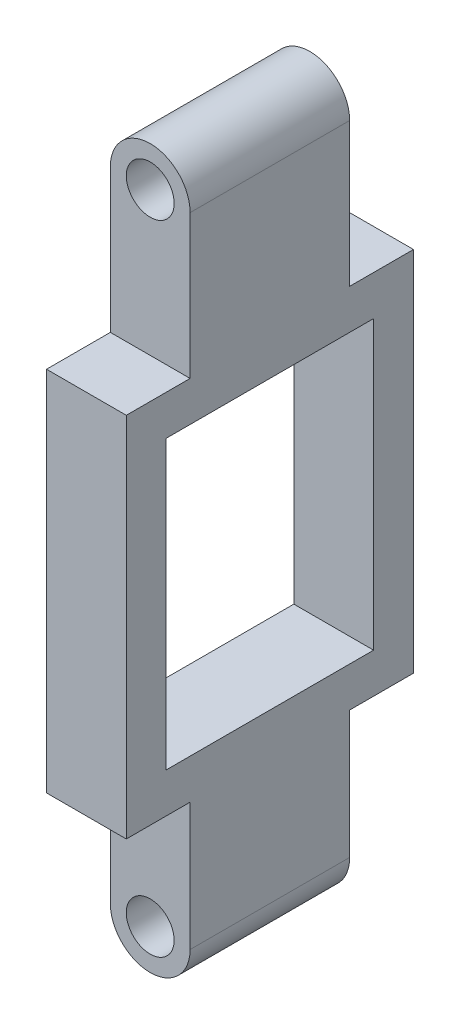
ISO-10303-21;
HEADER;
FILE_DESCRIPTION(('STEP AP214'),'2;1');
FILE_NAME('part.step','',(''),(''),'','','');
FILE_SCHEMA(('AUTOMOTIVE_DESIGN { 1 0 10303 214 1 1 1 1 }'));
ENDSEC;
DATA;
#1=APPLICATION_CONTEXT('core data for automotive mechanical design processes');
#2=APPLICATION_PROTOCOL_DEFINITION('international standard','automotive_design',2000,#1);
#3=PRODUCT_CONTEXT('',#1,'mechanical');
#4=PRODUCT('Part','Part','',(#3));
#5=PRODUCT_RELATED_PRODUCT_CATEGORY('part','',(#4));
#6=PRODUCT_DEFINITION_FORMATION('','',#4);
#7=PRODUCT_DEFINITION_CONTEXT('part definition',#1,'design');
#8=PRODUCT_DEFINITION('design','',#6,#7);
#9=PRODUCT_DEFINITION_SHAPE('','',#8);
#10=(LENGTH_UNIT() NAMED_UNIT(*) SI_UNIT(.MILLI.,.METRE.));
#11=(NAMED_UNIT(*) PLANE_ANGLE_UNIT() SI_UNIT($,.RADIAN.));
#12=(NAMED_UNIT(*) SI_UNIT($,.STERADIAN.) SOLID_ANGLE_UNIT());
#13=UNCERTAINTY_MEASURE_WITH_UNIT(LENGTH_MEASURE(1.E-05),#10,'distance_accuracy_value','');
#14=(GEOMETRIC_REPRESENTATION_CONTEXT(3) GLOBAL_UNCERTAINTY_ASSIGNED_CONTEXT((#13)) GLOBAL_UNIT_ASSIGNED_CONTEXT((#10,
#11,#12)) REPRESENTATION_CONTEXT('',''));
#15=CARTESIAN_POINT('',(0.,0.,0.));
#16=DIRECTION('',(0.,0.,1.));
#17=DIRECTION('',(1.,0.,0.));
#18=AXIS2_PLACEMENT_3D('',#15,#16,#17);
#19=CARTESIAN_POINT('',(0.,384.888851883363,-50.));
#20=DIRECTION('',(0.,0.,1.));
#21=DIRECTION('',(1.,0.,0.));
#22=AXIS2_PLACEMENT_3D('',#19,#20,#21);
#23=PLANE('',#22);
#24=CARTESIAN_POINT('',(0.,384.888851883363,-50.));
#25=DIRECTION('',(0.,0.,1.));
#26=DIRECTION('',(1.,0.,0.));
#27=AXIS2_PLACEMENT_3D('',#24,#25,#26);
#28=CIRCLE('',#27,15.);
#29=CARTESIAN_POINT('',(15.,384.888851883363,-50.));
#30=VERTEX_POINT('',#29);
#31=EDGE_CURVE('E285',#30,#30,#28,.T.);
#32=ORIENTED_EDGE('',*,*,#31,.T.);
#33=EDGE_LOOP('',(#32));
#34=FACE_BOUND('',#33,.T.);
#35=DIRECTION('',(1.,0.,0.));
#36=VECTOR('',#35,1.);
#37=CARTESIAN_POINT('',(0.,294.888851883363,-50.));
#38=LINE('',#37,#36);
#39=CARTESIAN_POINT('',(-25.,294.888851883363,-50.));
#40=VERTEX_POINT('',#39);
#41=CARTESIAN_POINT('',(25.,294.888851883363,-50.));
#42=VERTEX_POINT('',#41);
#43=EDGE_CURVE('E200',#40,#42,#38,.T.);
#44=ORIENTED_EDGE('',*,*,#43,.F.);
#45=DIRECTION('',(0.,-1.,0.));
#46=VECTOR('',#45,1.);
#47=CARTESIAN_POINT('',(-25.,384.888851883363,-50.));
#48=LINE('',#47,#46);
#49=CARTESIAN_POINT('',(-25.,384.888851883363,-50.));
#50=VERTEX_POINT('',#49);
#51=EDGE_CURVE('E318',#50,#40,#48,.T.);
#52=ORIENTED_EDGE('',*,*,#51,.F.);
#53=CARTESIAN_POINT('',(0.,384.888851883363,-50.));
#54=DIRECTION('',(0.,0.,1.));
#55=DIRECTION('',(1.,0.,0.));
#56=AXIS2_PLACEMENT_3D('',#53,#54,#55);
#57=CIRCLE('',#56,25.);
#58=CARTESIAN_POINT('',(25.,384.888851883363,-50.));
#59=VERTEX_POINT('',#58);
#60=EDGE_CURVE('E293',#59,#50,#57,.T.);
#61=ORIENTED_EDGE('',*,*,#60,.F.);
#62=DIRECTION('',(0.,1.,0.));
#63=VECTOR('',#62,1.);
#64=CARTESIAN_POINT('',(25.,384.888851883363,-50.));
#65=LINE('',#64,#63);
#66=EDGE_CURVE('E325',#42,#59,#65,.T.);
#67=ORIENTED_EDGE('',*,*,#66,.F.);
#68=EDGE_LOOP('',(#44,#52,#61,#67));
#69=FACE_BOUND('',#68,.T.);
#70=ADVANCED_FACE('F43',(#34,#69),#23,.F.);
#71=CARTESIAN_POINT('',(0.,384.888851883363,50.));
#72=DIRECTION('',(0.,0.,1.));
#73=DIRECTION('',(1.,0.,0.));
#74=AXIS2_PLACEMENT_3D('',#71,#72,#73);
#75=PLANE('',#74);
#76=CARTESIAN_POINT('',(0.,384.888851883363,50.));
#77=DIRECTION('',(0.,0.,1.));
#78=DIRECTION('',(1.,0.,0.));
#79=AXIS2_PLACEMENT_3D('',#76,#77,#78);
#80=CIRCLE('',#79,15.);
#81=CARTESIAN_POINT('',(15.,384.888851883363,50.));
#82=VERTEX_POINT('',#81);
#83=EDGE_CURVE('E289',#82,#82,#80,.T.);
#84=ORIENTED_EDGE('',*,*,#83,.F.);
#85=EDGE_LOOP('',(#84));
#86=FACE_BOUND('',#85,.T.);
#87=DIRECTION('',(0.,-1.,0.));
#88=VECTOR('',#87,1.);
#89=CARTESIAN_POINT('',(-25.,384.888851883363,50.));
#90=LINE('',#89,#88);
#91=CARTESIAN_POINT('',(-25.,384.888851883363,50.));
#92=VERTEX_POINT('',#91);
#93=CARTESIAN_POINT('',(-25.,294.888851883363,50.));
#94=VERTEX_POINT('',#93);
#95=EDGE_CURVE('E303',#92,#94,#90,.T.);
#96=ORIENTED_EDGE('',*,*,#95,.T.);
#97=DIRECTION('',(1.,0.,0.));
#98=VECTOR('',#97,1.);
#99=CARTESIAN_POINT('',(0.,294.888851883363,50.));
#100=LINE('',#99,#98);
#101=CARTESIAN_POINT('',(25.,294.888851883363,50.));
#102=VERTEX_POINT('',#101);
#103=EDGE_CURVE('E249',#94,#102,#100,.T.);
#104=ORIENTED_EDGE('',*,*,#103,.T.);
#105=DIRECTION('',(0.,1.,0.));
#106=VECTOR('',#105,1.);
#107=CARTESIAN_POINT('',(25.,384.888851883363,50.));
#108=LINE('',#107,#106);
#109=CARTESIAN_POINT('',(25.,384.888851883363,50.));
#110=VERTEX_POINT('',#109);
#111=EDGE_CURVE('E309',#102,#110,#108,.T.);
#112=ORIENTED_EDGE('',*,*,#111,.T.);
#113=CARTESIAN_POINT('',(0.,384.888851883363,50.));
#114=DIRECTION('',(0.,0.,1.));
#115=DIRECTION('',(1.,0.,0.));
#116=AXIS2_PLACEMENT_3D('',#113,#114,#115);
#117=CIRCLE('',#116,25.);
#118=EDGE_CURVE('E297',#110,#92,#117,.T.);
#119=ORIENTED_EDGE('',*,*,#118,.T.);
#120=EDGE_LOOP('',(#96,#104,#112,#119));
#121=FACE_BOUND('',#120,.T.);
#122=ADVANCED_FACE('F392',(#86,#121),#75,.T.);
#123=DIRECTION('',(1.,0.,0.));
#124=VECTOR('',#123,1.);
#125=CARTESIAN_POINT('',(0.,64.8888518833628,50.));
#126=LINE('',#125,#124);
#127=CARTESIAN_POINT('',(-25.,64.8888518833628,50.));
#128=VERTEX_POINT('',#127);
#129=CARTESIAN_POINT('',(25.,64.8888518833628,50.));
#130=VERTEX_POINT('',#129);
#131=EDGE_CURVE('E243',#128,#130,#126,.T.);
#132=ORIENTED_EDGE('',*,*,#131,.F.);
#133=CARTESIAN_POINT('',(-25.,-15.1111481166372,50.));
#134=VERTEX_POINT('',#133);
#135=EDGE_CURVE('E301',#128,#134,#90,.T.);
#136=ORIENTED_EDGE('',*,*,#135,.T.);
#137=CARTESIAN_POINT('',(0.,-15.1111481166372,50.));
#138=DIRECTION('',(0.,0.,1.));
#139=DIRECTION('',(1.,0.,0.));
#140=AXIS2_PLACEMENT_3D('',#137,#138,#139);
#141=CIRCLE('',#140,25.);
#142=CARTESIAN_POINT('',(25.,-15.1111481166372,50.));
#143=VERTEX_POINT('',#142);
#144=EDGE_CURVE('E306',#134,#143,#141,.T.);
#145=ORIENTED_EDGE('',*,*,#144,.T.);
#146=EDGE_CURVE('E310',#143,#130,#108,.T.);
#147=ORIENTED_EDGE('',*,*,#146,.T.);
#148=EDGE_LOOP('',(#132,#136,#145,#147));
#149=FACE_BOUND('',#148,.T.);
#150=CARTESIAN_POINT('',(0.,-15.1111481166372,50.));
#151=DIRECTION('',(0.,0.,1.));
#152=DIRECTION('',(1.,0.,0.));
#153=AXIS2_PLACEMENT_3D('',#150,#151,#152);
#154=CIRCLE('',#153,15.);
#155=CARTESIAN_POINT('',(15.,-15.1111481166372,50.));
#156=VERTEX_POINT('',#155);
#157=EDGE_CURVE('E281',#156,#156,#154,.T.);
#158=ORIENTED_EDGE('',*,*,#157,.F.);
#159=EDGE_LOOP('',(#158));
#160=FACE_BOUND('',#159,.T.);
#161=ADVANCED_FACE('F386',(#149,#160),#75,.T.);
#162=CARTESIAN_POINT('',(-25.,64.8888518833628,-50.));
#163=VERTEX_POINT('',#162);
#164=CARTESIAN_POINT('',(-25.,-15.1111481166372,-50.));
#165=VERTEX_POINT('',#164);
#166=EDGE_CURVE('E317',#163,#165,#48,.T.);
#167=ORIENTED_EDGE('',*,*,#166,.F.);
#168=DIRECTION('',(1.,0.,0.));
#169=VECTOR('',#168,1.);
#170=CARTESIAN_POINT('',(0.,64.8888518833628,-50.));
#171=LINE('',#170,#169);
#172=CARTESIAN_POINT('',(25.,64.8888518833628,-50.));
#173=VERTEX_POINT('',#172);
#174=EDGE_CURVE('E211',#163,#173,#171,.T.);
#175=ORIENTED_EDGE('',*,*,#174,.T.);
#176=CARTESIAN_POINT('',(25.,-15.1111481166372,-50.));
#177=VERTEX_POINT('',#176);
#178=EDGE_CURVE('E302',#177,#173,#65,.T.);
#179=ORIENTED_EDGE('',*,*,#178,.F.);
#180=CARTESIAN_POINT('',(0.,-15.1111481166372,-50.));
#181=DIRECTION('',(0.,0.,1.));
#182=DIRECTION('',(1.,0.,0.));
#183=AXIS2_PLACEMENT_3D('',#180,#181,#182);
#184=CIRCLE('',#183,25.);
#185=EDGE_CURVE('E322',#165,#177,#184,.T.);
#186=ORIENTED_EDGE('',*,*,#185,.F.);
#187=EDGE_LOOP('',(#167,#175,#179,#186));
#188=FACE_BOUND('',#187,.T.);
#189=CARTESIAN_POINT('',(0.,-15.1111481166372,-50.));
#190=DIRECTION('',(0.,0.,1.));
#191=DIRECTION('',(1.,0.,0.));
#192=AXIS2_PLACEMENT_3D('',#189,#190,#191);
#193=CIRCLE('',#192,15.);
#194=CARTESIAN_POINT('',(15.,-15.1111481166372,-50.));
#195=VERTEX_POINT('',#194);
#196=EDGE_CURVE('E280',#195,#195,#193,.T.);
#197=ORIENTED_EDGE('',*,*,#196,.T.);
#198=EDGE_LOOP('',(#197));
#199=FACE_BOUND('',#198,.T.);
#200=ADVANCED_FACE('F346',(#188,#199),#23,.F.);
#201=CARTESIAN_POINT('',(0.,384.888851883363,50.));
#202=DIRECTION('',(0.,0.,-1.));
#203=DIRECTION('',(-1.,0.,0.));
#204=AXIS2_PLACEMENT_3D('',#201,#202,#203);
#205=CYLINDRICAL_SURFACE('',#204,25.);
#206=ORIENTED_EDGE('',*,*,#60,.T.);
#207=DIRECTION('',(0.,0.,-1.));
#208=VECTOR('',#207,1.);
#209=CARTESIAN_POINT('',(-25.,384.888851883363,50.));
#210=LINE('',#209,#208);
#211=EDGE_CURVE('E11',#92,#50,#210,.T.);
#212=ORIENTED_EDGE('',*,*,#211,.F.);
#213=ORIENTED_EDGE('',*,*,#118,.F.);
#214=DIRECTION('',(0.,0.,-1.));
#215=VECTOR('',#214,1.);
#216=CARTESIAN_POINT('',(25.,384.888851883363,50.));
#217=LINE('',#216,#215);
#218=EDGE_CURVE('E313',#110,#59,#217,.T.);
#219=ORIENTED_EDGE('',*,*,#218,.T.);
#220=EDGE_LOOP('',(#206,#212,#213,#219));
#221=FACE_BOUND('',#220,.T.);
#222=ADVANCED_FACE('F45',(#221),#205,.T.);
#223=CARTESIAN_POINT('',(-25.,384.888851883363,50.));
#224=DIRECTION('',(1.,0.,0.));
#225=DIRECTION('',(0.,1.,0.));
#226=AXIS2_PLACEMENT_3D('',#223,#224,#225);
#227=PLANE('',#226);
#228=DIRECTION('',(0.,0.,1.));
#229=VECTOR('',#228,1.);
#230=CARTESIAN_POINT('',(-25.0000000000001,269.888851883363,65.));
#231=LINE('',#230,#229);
#232=CARTESIAN_POINT('',(-25.0000000000001,269.888851883363,-65.));
#233=VERTEX_POINT('',#232);
#234=CARTESIAN_POINT('',(-25.0000000000001,269.888851883363,65.));
#235=VERTEX_POINT('',#234);
#236=EDGE_CURVE('E166',#233,#235,#231,.T.);
#237=ORIENTED_EDGE('',*,*,#236,.T.);
#238=DIRECTION('',(0.,-1.,0.));
#239=VECTOR('',#238,1.);
#240=CARTESIAN_POINT('',(-25.0000000000001,269.888851883363,65.));
#241=LINE('',#240,#239);
#242=CARTESIAN_POINT('',(-25.0000000000001,89.8888518833628,65.));
#243=VERTEX_POINT('',#242);
#244=EDGE_CURVE('E159',#235,#243,#241,.T.);
#245=ORIENTED_EDGE('',*,*,#244,.T.);
#246=DIRECTION('',(0.,0.,-1.));
#247=VECTOR('',#246,1.);
#248=CARTESIAN_POINT('',(-25.0000000000001,89.8888518833628,65.));
#249=LINE('',#248,#247);
#250=CARTESIAN_POINT('',(-25.,89.8888518833628,-65.));
#251=VERTEX_POINT('',#250);
#252=EDGE_CURVE('E169',#243,#251,#249,.T.);
#253=ORIENTED_EDGE('',*,*,#252,.T.);
#254=DIRECTION('',(0.,1.,0.));
#255=VECTOR('',#254,1.);
#256=CARTESIAN_POINT('',(-25.0000000000001,269.888851883363,-65.));
#257=LINE('',#256,#255);
#258=EDGE_CURVE('E59',#251,#233,#257,.T.);
#259=ORIENTED_EDGE('',*,*,#258,.T.);
#260=EDGE_LOOP('',(#237,#245,#253,#259));
#261=FACE_BOUND('',#260,.T.);
#262=ORIENTED_EDGE('',*,*,#51,.T.);
#263=DIRECTION('',(0.,0.,1.));
#264=VECTOR('',#263,1.);
#265=CARTESIAN_POINT('',(-25.,294.888851883363,-90.));
#266=LINE('',#265,#264);
#267=CARTESIAN_POINT('',(-25.,294.888851883363,-90.));
#268=VERTEX_POINT('',#267);
#269=EDGE_CURVE('E239',#268,#40,#266,.T.);
#270=ORIENTED_EDGE('',*,*,#269,.F.);
#271=DIRECTION('',(0.,-1.,0.));
#272=VECTOR('',#271,1.);
#273=CARTESIAN_POINT('',(-25.,0.,-90.));
#274=LINE('',#273,#272);
#275=CARTESIAN_POINT('',(-25.,64.8888518833628,-90.));
#276=VERTEX_POINT('',#275);
#277=EDGE_CURVE('E206',#268,#276,#274,.T.);
#278=ORIENTED_EDGE('',*,*,#277,.T.);
#279=DIRECTION('',(0.,0.,1.));
#280=VECTOR('',#279,1.);
#281=CARTESIAN_POINT('',(-25.,64.8888518833628,-90.));
#282=LINE('',#281,#280);
#283=EDGE_CURVE('E222',#276,#163,#282,.T.);
#284=ORIENTED_EDGE('',*,*,#283,.T.);
#285=ORIENTED_EDGE('',*,*,#166,.T.);
#286=DIRECTION('',(0.,0.,-1.));
#287=VECTOR('',#286,1.);
#288=CARTESIAN_POINT('',(-25.,-15.1111481166372,50.));
#289=LINE('',#288,#287);
#290=EDGE_CURVE('E52',#134,#165,#289,.T.);
#291=ORIENTED_EDGE('',*,*,#290,.F.);
#292=ORIENTED_EDGE('',*,*,#135,.F.);
#293=DIRECTION('',(0.,0.,-1.));
#294=VECTOR('',#293,1.);
#295=CARTESIAN_POINT('',(-25.,64.8888518833628,90.));
#296=LINE('',#295,#294);
#297=CARTESIAN_POINT('',(-25.,64.8888518833628,90.));
#298=VERTEX_POINT('',#297);
#299=EDGE_CURVE('E276',#298,#128,#296,.T.);
#300=ORIENTED_EDGE('',*,*,#299,.F.);
#301=DIRECTION('',(0.,-1.,0.));
#302=VECTOR('',#301,1.);
#303=CARTESIAN_POINT('',(-25.,0.,90.));
#304=LINE('',#303,#302);
#305=CARTESIAN_POINT('',(-25.,294.888851883363,90.));
#306=VERTEX_POINT('',#305);
#307=EDGE_CURVE('E244',#306,#298,#304,.T.);
#308=ORIENTED_EDGE('',*,*,#307,.F.);
#309=DIRECTION('',(0.,0.,-1.));
#310=VECTOR('',#309,1.);
#311=CARTESIAN_POINT('',(-25.,294.888851883363,90.));
#312=LINE('',#311,#310);
#313=EDGE_CURVE('E259',#306,#94,#312,.T.);
#314=ORIENTED_EDGE('',*,*,#313,.T.);
#315=ORIENTED_EDGE('',*,*,#95,.F.);
#316=ORIENTED_EDGE('',*,*,#211,.T.);
#317=EDGE_LOOP('',(#262,#270,#278,#284,#285,#291,#292,#300,#308,#314,#315,#316));
#318=FACE_BOUND('',#317,.T.);
#319=ADVANCED_FACE('F174',(#261,#318),#227,.F.);
#320=CARTESIAN_POINT('',(0.,-15.1111481166372,50.));
#321=DIRECTION('',(0.,0.,-1.));
#322=DIRECTION('',(-1.,0.,0.));
#323=AXIS2_PLACEMENT_3D('',#320,#321,#322);
#324=CYLINDRICAL_SURFACE('',#323,25.);
#325=ORIENTED_EDGE('',*,*,#185,.T.);
#326=DIRECTION('',(0.,0.,-1.));
#327=VECTOR('',#326,1.);
#328=CARTESIAN_POINT('',(25.,-15.1111481166372,50.));
#329=LINE('',#328,#327);
#330=EDGE_CURVE('E332',#143,#177,#329,.T.);
#331=ORIENTED_EDGE('',*,*,#330,.F.);
#332=ORIENTED_EDGE('',*,*,#144,.F.);
#333=ORIENTED_EDGE('',*,*,#290,.T.);
#334=EDGE_LOOP('',(#325,#331,#332,#333));
#335=FACE_BOUND('',#334,.T.);
#336=ADVANCED_FACE('F341',(#335),#324,.T.);
#337=CARTESIAN_POINT('',(25.,384.888851883363,50.));
#338=DIRECTION('',(-1.,0.,0.));
#339=DIRECTION('',(0.,-1.,0.));
#340=AXIS2_PLACEMENT_3D('',#337,#338,#339);
#341=PLANE('',#340);
#342=DIRECTION('',(0.,0.,-1.));
#343=VECTOR('',#342,1.);
#344=CARTESIAN_POINT('',(25.,89.8888518833628,65.));
#345=LINE('',#344,#343);
#346=CARTESIAN_POINT('',(25.,89.8888518833628,65.));
#347=VERTEX_POINT('',#346);
#348=CARTESIAN_POINT('',(25.,89.8888518833628,-65.));
#349=VERTEX_POINT('',#348);
#350=EDGE_CURVE('E191',#347,#349,#345,.T.);
#351=ORIENTED_EDGE('',*,*,#350,.F.);
#352=DIRECTION('',(0.,-1.,0.));
#353=VECTOR('',#352,1.);
#354=CARTESIAN_POINT('',(25.,269.888851883363,65.));
#355=LINE('',#354,#353);
#356=CARTESIAN_POINT('',(25.,269.888851883363,65.));
#357=VERTEX_POINT('',#356);
#358=EDGE_CURVE('E67',#357,#347,#355,.T.);
#359=ORIENTED_EDGE('',*,*,#358,.F.);
#360=DIRECTION('',(0.,0.,1.));
#361=VECTOR('',#360,1.);
#362=CARTESIAN_POINT('',(25.,269.888851883363,65.));
#363=LINE('',#362,#361);
#364=CARTESIAN_POINT('',(25.,269.888851883363,-65.));
#365=VERTEX_POINT('',#364);
#366=EDGE_CURVE('E178',#365,#357,#363,.T.);
#367=ORIENTED_EDGE('',*,*,#366,.F.);
#368=DIRECTION('',(0.,1.,0.));
#369=VECTOR('',#368,1.);
#370=CARTESIAN_POINT('',(25.,269.888851883363,-65.));
#371=LINE('',#370,#369);
#372=EDGE_CURVE('E182',#349,#365,#371,.T.);
#373=ORIENTED_EDGE('',*,*,#372,.F.);
#374=EDGE_LOOP('',(#351,#359,#367,#373));
#375=FACE_BOUND('',#374,.T.);
#376=ORIENTED_EDGE('',*,*,#178,.T.);
#377=DIRECTION('',(0.,0.,1.));
#378=VECTOR('',#377,1.);
#379=CARTESIAN_POINT('',(25.,64.8888518833628,-90.));
#380=LINE('',#379,#378);
#381=CARTESIAN_POINT('',(25.,64.8888518833628,-90.));
#382=VERTEX_POINT('',#381);
#383=EDGE_CURVE('E231',#382,#173,#380,.T.);
#384=ORIENTED_EDGE('',*,*,#383,.F.);
#385=DIRECTION('',(0.,1.,0.));
#386=VECTOR('',#385,1.);
#387=CARTESIAN_POINT('',(25.,0.,-90.));
#388=LINE('',#387,#386);
#389=CARTESIAN_POINT('',(25.,294.888851883363,-90.));
#390=VERTEX_POINT('',#389);
#391=EDGE_CURVE('E214',#382,#390,#388,.T.);
#392=ORIENTED_EDGE('',*,*,#391,.T.);
#393=DIRECTION('',(0.,0.,1.));
#394=VECTOR('',#393,1.);
#395=CARTESIAN_POINT('',(25.,294.888851883363,-90.));
#396=LINE('',#395,#394);
#397=EDGE_CURVE('E235',#390,#42,#396,.T.);
#398=ORIENTED_EDGE('',*,*,#397,.T.);
#399=ORIENTED_EDGE('',*,*,#66,.T.);
#400=ORIENTED_EDGE('',*,*,#218,.F.);
#401=ORIENTED_EDGE('',*,*,#111,.F.);
#402=DIRECTION('',(0.,0.,-1.));
#403=VECTOR('',#402,1.);
#404=CARTESIAN_POINT('',(25.,294.888851883363,90.));
#405=LINE('',#404,#403);
#406=CARTESIAN_POINT('',(25.,294.888851883363,90.));
#407=VERTEX_POINT('',#406);
#408=EDGE_CURVE('E268',#407,#102,#405,.T.);
#409=ORIENTED_EDGE('',*,*,#408,.F.);
#410=DIRECTION('',(0.,1.,0.));
#411=VECTOR('',#410,1.);
#412=CARTESIAN_POINT('',(25.,0.,90.));
#413=LINE('',#412,#411);
#414=CARTESIAN_POINT('',(25.,64.8888518833628,90.));
#415=VERTEX_POINT('',#414);
#416=EDGE_CURVE('E252',#415,#407,#413,.T.);
#417=ORIENTED_EDGE('',*,*,#416,.F.);
#418=DIRECTION('',(0.,0.,-1.));
#419=VECTOR('',#418,1.);
#420=CARTESIAN_POINT('',(25.,64.8888518833628,90.));
#421=LINE('',#420,#419);
#422=EDGE_CURVE('E272',#415,#130,#421,.T.);
#423=ORIENTED_EDGE('',*,*,#422,.T.);
#424=ORIENTED_EDGE('',*,*,#146,.F.);
#425=ORIENTED_EDGE('',*,*,#330,.T.);
#426=EDGE_LOOP('',(#376,#384,#392,#398,#399,#400,#401,#409,#417,#423,#424,#425));
#427=FACE_BOUND('',#426,.T.);
#428=ADVANCED_FACE('F350',(#375,#427),#341,.F.);
#429=CARTESIAN_POINT('',(0.,384.888851883363,50.));
#430=DIRECTION('',(0.,0.,-1.));
#431=DIRECTION('',(-1.,0.,0.));
#432=AXIS2_PLACEMENT_3D('',#429,#430,#431);
#433=CYLINDRICAL_SURFACE('',#432,15.);
#434=ORIENTED_EDGE('',*,*,#83,.T.);
#435=EDGE_LOOP('',(#434));
#436=FACE_BOUND('',#435,.T.);
#437=ORIENTED_EDGE('',*,*,#31,.F.);
#438=EDGE_LOOP('',(#437));
#439=FACE_BOUND('',#438,.T.);
#440=ADVANCED_FACE('F399',(#436,#439),#433,.F.);
#441=CARTESIAN_POINT('',(0.,-15.1111481166372,50.));
#442=DIRECTION('',(0.,0.,-1.));
#443=DIRECTION('',(-1.,0.,0.));
#444=AXIS2_PLACEMENT_3D('',#441,#442,#443);
#445=CYLINDRICAL_SURFACE('',#444,15.);
#446=ORIENTED_EDGE('',*,*,#157,.T.);
#447=EDGE_LOOP('',(#446));
#448=FACE_BOUND('',#447,.T.);
#449=ORIENTED_EDGE('',*,*,#196,.F.);
#450=EDGE_LOOP('',(#449));
#451=FACE_BOUND('',#450,.T.);
#452=ADVANCED_FACE('F396',(#448,#451),#445,.F.);
#453=CARTESIAN_POINT('',(0.,64.8888518833628,90.));
#454=DIRECTION('',(0.,1.,0.));
#455=DIRECTION('',(0.,0.,1.));
#456=AXIS2_PLACEMENT_3D('',#453,#454,#455);
#457=PLANE('',#456);
#458=ORIENTED_EDGE('',*,*,#131,.T.);
#459=ORIENTED_EDGE('',*,*,#422,.F.);
#460=DIRECTION('',(1.,0.,0.));
#461=VECTOR('',#460,1.);
#462=CARTESIAN_POINT('',(0.,64.8888518833628,90.));
#463=LINE('',#462,#461);
#464=EDGE_CURVE('E248',#298,#415,#463,.T.);
#465=ORIENTED_EDGE('',*,*,#464,.F.);
#466=ORIENTED_EDGE('',*,*,#299,.T.);
#467=EDGE_LOOP('',(#458,#459,#465,#466));
#468=FACE_BOUND('',#467,.T.);
#469=ADVANCED_FACE('F384',(#468),#457,.F.);
#470=CARTESIAN_POINT('',(0.,294.888851883363,90.));
#471=DIRECTION('',(0.,1.,0.));
#472=DIRECTION('',(0.,0.,1.));
#473=AXIS2_PLACEMENT_3D('',#470,#471,#472);
#474=PLANE('',#473);
#475=ORIENTED_EDGE('',*,*,#103,.F.);
#476=ORIENTED_EDGE('',*,*,#313,.F.);
#477=DIRECTION('',(1.,0.,0.));
#478=VECTOR('',#477,1.);
#479=CARTESIAN_POINT('',(0.,294.888851883363,90.));
#480=LINE('',#479,#478);
#481=EDGE_CURVE('E255',#306,#407,#480,.T.);
#482=ORIENTED_EDGE('',*,*,#481,.T.);
#483=ORIENTED_EDGE('',*,*,#408,.T.);
#484=EDGE_LOOP('',(#475,#476,#482,#483));
#485=FACE_BOUND('',#484,.T.);
#486=ADVANCED_FACE('F376',(#485),#474,.T.);
#487=CARTESIAN_POINT('',(0.,0.,90.));
#488=DIRECTION('',(0.,0.,1.));
#489=DIRECTION('',(1.,0.,0.));
#490=AXIS2_PLACEMENT_3D('',#487,#488,#489);
#491=PLANE('',#490);
#492=ORIENTED_EDGE('',*,*,#307,.T.);
#493=ORIENTED_EDGE('',*,*,#464,.T.);
#494=ORIENTED_EDGE('',*,*,#416,.T.);
#495=ORIENTED_EDGE('',*,*,#481,.F.);
#496=EDGE_LOOP('',(#492,#493,#494,#495));
#497=FACE_BOUND('',#496,.T.);
#498=ADVANCED_FACE('F380',(#497),#491,.T.);
#499=CARTESIAN_POINT('',(0.,294.888851883363,-90.));
#500=DIRECTION('',(0.,-1.,0.));
#501=DIRECTION('',(0.,0.,-1.));
#502=AXIS2_PLACEMENT_3D('',#499,#500,#501);
#503=PLANE('',#502);
#504=ORIENTED_EDGE('',*,*,#43,.T.);
#505=ORIENTED_EDGE('',*,*,#397,.F.);
#506=DIRECTION('',(1.,0.,0.));
#507=VECTOR('',#506,1.);
#508=CARTESIAN_POINT('',(0.,294.888851883363,-90.));
#509=LINE('',#508,#507);
#510=EDGE_CURVE('E210',#268,#390,#509,.T.);
#511=ORIENTED_EDGE('',*,*,#510,.F.);
#512=ORIENTED_EDGE('',*,*,#269,.T.);
#513=EDGE_LOOP('',(#504,#505,#511,#512));
#514=FACE_BOUND('',#513,.T.);
#515=ADVANCED_FACE('F363',(#514),#503,.F.);
#516=CARTESIAN_POINT('',(0.,64.8888518833628,-90.));
#517=DIRECTION('',(0.,-1.,0.));
#518=DIRECTION('',(0.,0.,-1.));
#519=AXIS2_PLACEMENT_3D('',#516,#517,#518);
#520=PLANE('',#519);
#521=ORIENTED_EDGE('',*,*,#174,.F.);
#522=ORIENTED_EDGE('',*,*,#283,.F.);
#523=DIRECTION('',(1.,0.,0.));
#524=VECTOR('',#523,1.);
#525=CARTESIAN_POINT('',(0.,64.8888518833628,-90.));
#526=LINE('',#525,#524);
#527=EDGE_CURVE('E218',#276,#382,#526,.T.);
#528=ORIENTED_EDGE('',*,*,#527,.T.);
#529=ORIENTED_EDGE('',*,*,#383,.T.);
#530=EDGE_LOOP('',(#521,#522,#528,#529));
#531=FACE_BOUND('',#530,.T.);
#532=ADVANCED_FACE('F354',(#531),#520,.T.);
#533=CARTESIAN_POINT('',(0.,0.,-90.));
#534=DIRECTION('',(0.,0.,-1.));
#535=DIRECTION('',(1.,0.,0.));
#536=AXIS2_PLACEMENT_3D('',#533,#534,#535);
#537=PLANE('',#536);
#538=ORIENTED_EDGE('',*,*,#277,.F.);
#539=ORIENTED_EDGE('',*,*,#510,.T.);
#540=ORIENTED_EDGE('',*,*,#391,.F.);
#541=ORIENTED_EDGE('',*,*,#527,.F.);
#542=EDGE_LOOP('',(#538,#539,#540,#541));
#543=FACE_BOUND('',#542,.T.);
#544=ADVANCED_FACE('F358',(#543),#537,.T.);
#545=CARTESIAN_POINT('',(-25.0000000000001,269.888851883363,65.));
#546=DIRECTION('',(0.,0.,1.));
#547=DIRECTION('',(0.,-1.,0.));
#548=AXIS2_PLACEMENT_3D('',#545,#546,#547);
#549=PLANE('',#548);
#550=ORIENTED_EDGE('',*,*,#358,.T.);
#551=DIRECTION('',(1.,0.,0.));
#552=VECTOR('',#551,1.);
#553=CARTESIAN_POINT('',(-25.0000000000001,89.8888518833628,65.));
#554=LINE('',#553,#552);
#555=EDGE_CURVE('E155',#243,#347,#554,.T.);
#556=ORIENTED_EDGE('',*,*,#555,.F.);
#557=ORIENTED_EDGE('',*,*,#244,.F.);
#558=DIRECTION('',(1.,0.,0.));
#559=VECTOR('',#558,1.);
#560=CARTESIAN_POINT('',(-25.0000000000001,269.888851883363,65.));
#561=LINE('',#560,#559);
#562=EDGE_CURVE('E197',#235,#357,#561,.T.);
#563=ORIENTED_EDGE('',*,*,#562,.T.);
#564=EDGE_LOOP('',(#550,#556,#557,#563));
#565=FACE_BOUND('',#564,.T.);
#566=ADVANCED_FACE('F157',(#565),#549,.F.);
#567=CARTESIAN_POINT('',(-25.0000000000001,269.888851883363,65.));
#568=DIRECTION('',(0.,1.,0.));
#569=DIRECTION('',(-1.,0.,0.));
#570=AXIS2_PLACEMENT_3D('',#567,#568,#569);
#571=PLANE('',#570);
#572=ORIENTED_EDGE('',*,*,#366,.T.);
#573=ORIENTED_EDGE('',*,*,#562,.F.);
#574=ORIENTED_EDGE('',*,*,#236,.F.);
#575=DIRECTION('',(1.,0.,0.));
#576=VECTOR('',#575,1.);
#577=CARTESIAN_POINT('',(-25.0000000000001,269.888851883363,-65.));
#578=LINE('',#577,#576);
#579=EDGE_CURVE('E201',#233,#365,#578,.T.);
#580=ORIENTED_EDGE('',*,*,#579,.T.);
#581=EDGE_LOOP('',(#572,#573,#574,#580));
#582=FACE_BOUND('',#581,.T.);
#583=ADVANCED_FACE('F441',(#582),#571,.F.);
#584=CARTESIAN_POINT('',(-25.0000000000001,269.888851883363,-65.));
#585=DIRECTION('',(0.,0.,-1.));
#586=DIRECTION('',(0.,1.,0.));
#587=AXIS2_PLACEMENT_3D('',#584,#585,#586);
#588=PLANE('',#587);
#589=ORIENTED_EDGE('',*,*,#372,.T.);
#590=ORIENTED_EDGE('',*,*,#579,.F.);
#591=ORIENTED_EDGE('',*,*,#258,.F.);
#592=DIRECTION('',(1.,0.,0.));
#593=VECTOR('',#592,1.);
#594=CARTESIAN_POINT('',(-25.0000000000001,89.8888518833628,-65.));
#595=LINE('',#594,#593);
#596=EDGE_CURVE('E165',#251,#349,#595,.T.);
#597=ORIENTED_EDGE('',*,*,#596,.T.);
#598=EDGE_LOOP('',(#589,#590,#591,#597));
#599=FACE_BOUND('',#598,.T.);
#600=ADVANCED_FACE('F444',(#599),#588,.F.);
#601=CARTESIAN_POINT('',(-25.0000000000001,89.8888518833628,65.));
#602=DIRECTION('',(0.,-1.,0.));
#603=DIRECTION('',(1.,0.,0.));
#604=AXIS2_PLACEMENT_3D('',#601,#602,#603);
#605=PLANE('',#604);
#606=ORIENTED_EDGE('',*,*,#350,.T.);
#607=ORIENTED_EDGE('',*,*,#596,.F.);
#608=ORIENTED_EDGE('',*,*,#252,.F.);
#609=ORIENTED_EDGE('',*,*,#555,.T.);
#610=EDGE_LOOP('',(#606,#607,#608,#609));
#611=FACE_BOUND('',#610,.T.);
#612=ADVANCED_FACE('F170',(#611),#605,.F.);
#613=CLOSED_SHELL('',(#70,#122,#161,#200,#222,#319,#336,#428,#440,#452,#469,#486,#498,#515,#532,
#544,#566,#583,#600,#612));
#614=MANIFOLD_SOLID_BREP('B2',#613);
#615=ADVANCED_BREP_SHAPE_REPRESENTATION('',(#18,#614),#14);
#616=SHAPE_DEFINITION_REPRESENTATION(#9,#615);
ENDSEC;
END-ISO-10303-21;
